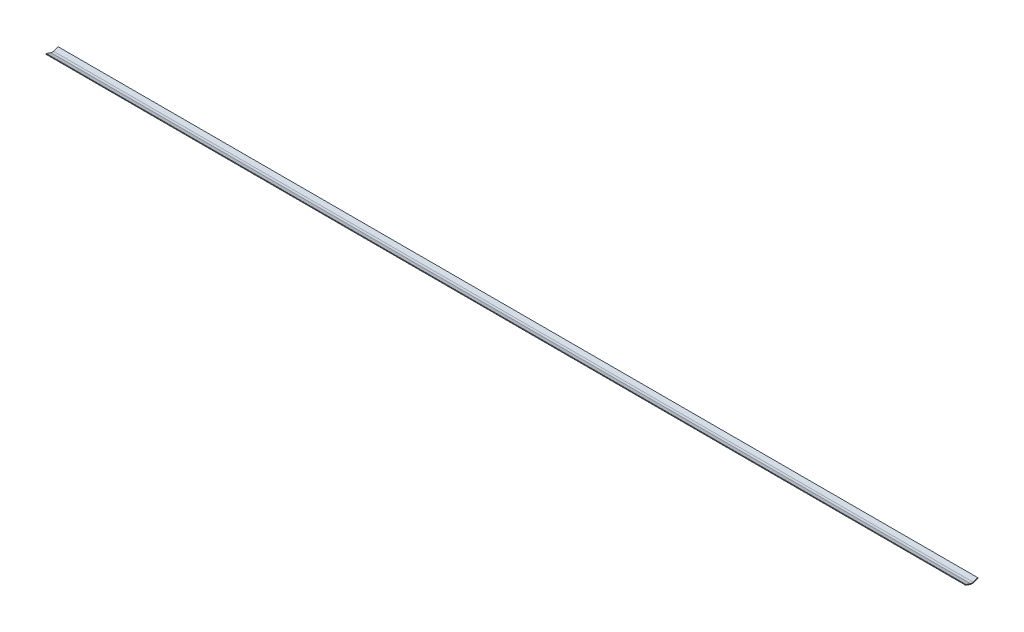
ISO-10303-21;
HEADER;
FILE_DESCRIPTION(('STEP AP214'),'2;1');
FILE_NAME('part.step','',(''),(''),'','','');
FILE_SCHEMA(('AUTOMOTIVE_DESIGN { 1 0 10303 214 1 1 1 1 }'));
ENDSEC;
DATA;
#1=APPLICATION_CONTEXT('core data for automotive mechanical design processes');
#2=APPLICATION_PROTOCOL_DEFINITION('international standard','automotive_design',2000,#1);
#3=PRODUCT_CONTEXT('',#1,'mechanical');
#4=PRODUCT('Part','Part','',(#3));
#5=PRODUCT_RELATED_PRODUCT_CATEGORY('part','',(#4));
#6=PRODUCT_DEFINITION_FORMATION('','',#4);
#7=PRODUCT_DEFINITION_CONTEXT('part definition',#1,'design');
#8=PRODUCT_DEFINITION('design','',#6,#7);
#9=PRODUCT_DEFINITION_SHAPE('','',#8);
#10=(LENGTH_UNIT() NAMED_UNIT(*) SI_UNIT(.MILLI.,.METRE.));
#11=(NAMED_UNIT(*) PLANE_ANGLE_UNIT() SI_UNIT($,.RADIAN.));
#12=(NAMED_UNIT(*) SI_UNIT($,.STERADIAN.) SOLID_ANGLE_UNIT());
#13=UNCERTAINTY_MEASURE_WITH_UNIT(LENGTH_MEASURE(1.E-05),#10,'distance_accuracy_value','');
#14=(GEOMETRIC_REPRESENTATION_CONTEXT(3) GLOBAL_UNCERTAINTY_ASSIGNED_CONTEXT((#13)) GLOBAL_UNIT_ASSIGNED_CONTEXT((#10,
#11,#12)) REPRESENTATION_CONTEXT('',''));
#15=CARTESIAN_POINT('',(0.,0.,0.));
#16=DIRECTION('',(0.,0.,1.));
#17=DIRECTION('',(1.,0.,0.));
#18=AXIS2_PLACEMENT_3D('',#15,#16,#17);
#19=CARTESIAN_POINT('',(1499.,1.65334887105103,4.84469669191699));
#20=DIRECTION('',(1.,0.,0.));
#21=DIRECTION('',(0.,0.,-1.));
#22=AXIS2_PLACEMENT_3D('',#19,#20,#21);
#23=PLANE('',#22);
#24=DIRECTION('',(0.,0.946405865397737,-0.322979779461132));
#25=VECTOR('',#24,1.);
#26=CARTESIAN_POINT('',(1499.,1.65334887105103,4.84469669191699));
#27=LINE('',#26,#25);
#28=CARTESIAN_POINT('',(1499.,1.65334887105103,4.84469669191699));
#29=VERTEX_POINT('',#28);
#30=CARTESIAN_POINT('',(1499.,3.54616060184651,4.19873713299472));
#31=VERTEX_POINT('',#30);
#32=EDGE_CURVE('E11',#29,#31,#27,.T.);
#33=ORIENTED_EDGE('',*,*,#32,.F.);
#34=CARTESIAN_POINT('',(1499.,15.8494368520171,0.));
#35=DIRECTION('',(1.,0.,0.));
#36=DIRECTION('',(0.,0.,-1.));
#37=AXIS2_PLACEMENT_3D('',#34,#35,#36);
#38=CIRCLE('',#37,15.);
#39=CARTESIAN_POINT('',(1499.,1.65334887105103,-4.84469669191697));
#40=VERTEX_POINT('',#39);
#41=EDGE_CURVE('E135',#40,#29,#38,.F.);
#42=ORIENTED_EDGE('',*,*,#41,.F.);
#43=DIRECTION('',(0.,-0.946405865397735,-0.322979779461137));
#44=VECTOR('',#43,1.);
#45=CARTESIAN_POINT('',(1499.,3.5461606018465,-4.1987371329947));
#46=LINE('',#45,#44);
#47=CARTESIAN_POINT('',(1499.,3.5461606018465,-4.1987371329947));
#48=VERTEX_POINT('',#47);
#49=EDGE_CURVE('E46',#48,#40,#46,.T.);
#50=ORIENTED_EDGE('',*,*,#49,.F.);
#51=CARTESIAN_POINT('',(1499.,15.8494368520171,0.));
#52=DIRECTION('',(1.,0.,0.));
#53=DIRECTION('',(0.,0.,-1.));
#54=AXIS2_PLACEMENT_3D('',#51,#52,#53);
#55=CIRCLE('',#54,13.);
#56=EDGE_CURVE('E128',#48,#31,#55,.F.);
#57=ORIENTED_EDGE('',*,*,#56,.T.);
#58=EDGE_LOOP('',(#33,#42,#50,#57));
#59=FACE_BOUND('',#58,.T.);
#60=ADVANCED_FACE('F38',(#59),#23,.T.);
#61=CARTESIAN_POINT('',(1499.,3.5461606018465,-4.1987371329947));
#62=DIRECTION('',(1.,0.,0.));
#63=DIRECTION('',(0.,0.,-1.));
#64=AXIS2_PLACEMENT_3D('',#61,#62,#63);
#65=PLANE('',#64);
#66=DIRECTION('',(0.,0.322979779461132,0.946405865397736));
#67=VECTOR('',#66,1.);
#68=CARTESIAN_POINT('',(1499.,0.,0.));
#69=LINE('',#68,#67);
#70=CARTESIAN_POINT('',(1499.,6.82539682539682,20.));
#71=VERTEX_POINT('',#70);
#72=EDGE_CURVE('E184',#29,#71,#69,.T.);
#73=ORIENTED_EDGE('',*,*,#72,.F.);
#74=ORIENTED_EDGE('',*,*,#32,.T.);
#75=DIRECTION('',(0.,0.322979779461132,0.946405865397737));
#76=VECTOR('',#75,1.);
#77=CARTESIAN_POINT('',(1499.,1.89281173079547,-0.645959558922264));
#78=LINE('',#77,#76);
#79=CARTESIAN_POINT('',(1499.,8.71820855619229,19.3540404410777));
#80=VERTEX_POINT('',#79);
#81=EDGE_CURVE('E94',#31,#80,#78,.T.);
#82=ORIENTED_EDGE('',*,*,#81,.T.);
#83=DIRECTION('',(0.,0.946405865397737,-0.32297977946113));
#84=VECTOR('',#83,1.);
#85=CARTESIAN_POINT('',(1499.,6.82539682539682,20.));
#86=LINE('',#85,#84);
#87=EDGE_CURVE('E341',#71,#80,#86,.T.);
#88=ORIENTED_EDGE('',*,*,#87,.F.);
#89=EDGE_LOOP('',(#73,#74,#82,#88));
#90=FACE_BOUND('',#89,.T.);
#91=ADVANCED_FACE('F192',(#90),#65,.T.);
#92=CARTESIAN_POINT('',(-1499.,1.65334887105103,-4.84469669191697));
#93=DIRECTION('',(-1.,0.,0.));
#94=DIRECTION('',(0.,0.,1.));
#95=AXIS2_PLACEMENT_3D('',#92,#93,#94);
#96=PLANE('',#95);
#97=DIRECTION('',(0.,0.946405865397735,0.322979779461137));
#98=VECTOR('',#97,1.);
#99=CARTESIAN_POINT('',(-1499.,1.65334887105103,-4.84469669191697));
#100=LINE('',#99,#98);
#101=CARTESIAN_POINT('',(-1499.,1.65334887105103,-4.84469669191697));
#102=VERTEX_POINT('',#101);
#103=CARTESIAN_POINT('',(-1499.,3.5461606018465,-4.1987371329947));
#104=VERTEX_POINT('',#103);
#105=EDGE_CURVE('E81',#102,#104,#100,.T.);
#106=ORIENTED_EDGE('',*,*,#105,.F.);
#107=CARTESIAN_POINT('',(-1499.,15.8494368520171,0.));
#108=DIRECTION('',(1.,0.,0.));
#109=DIRECTION('',(0.,0.,-1.));
#110=AXIS2_PLACEMENT_3D('',#107,#108,#109);
#111=CIRCLE('',#110,15.);
#112=CARTESIAN_POINT('',(-1499.,1.65334887105103,4.84469669191699));
#113=VERTEX_POINT('',#112);
#114=EDGE_CURVE('E150',#102,#113,#111,.F.);
#115=ORIENTED_EDGE('',*,*,#114,.T.);
#116=DIRECTION('',(0.,-0.946405865397737,0.322979779461132));
#117=VECTOR('',#116,1.);
#118=CARTESIAN_POINT('',(-1499.,3.54616060184651,4.19873713299472));
#119=LINE('',#118,#117);
#120=CARTESIAN_POINT('',(-1499.,3.54616060184651,4.19873713299472));
#121=VERTEX_POINT('',#120);
#122=EDGE_CURVE('E88',#121,#113,#119,.T.);
#123=ORIENTED_EDGE('',*,*,#122,.F.);
#124=CARTESIAN_POINT('',(-1499.,15.8494368520171,0.));
#125=DIRECTION('',(1.,0.,0.));
#126=DIRECTION('',(0.,0.,-1.));
#127=AXIS2_PLACEMENT_3D('',#124,#125,#126);
#128=CIRCLE('',#127,13.);
#129=EDGE_CURVE('E157',#104,#121,#128,.F.);
#130=ORIENTED_EDGE('',*,*,#129,.F.);
#131=EDGE_LOOP('',(#106,#115,#123,#130));
#132=FACE_BOUND('',#131,.T.);
#133=ADVANCED_FACE('F190',(#132),#96,.T.);
#134=CARTESIAN_POINT('',(-1499.,3.54616060184651,4.19873713299472));
#135=DIRECTION('',(-1.,0.,0.));
#136=DIRECTION('',(0.,0.,1.));
#137=AXIS2_PLACEMENT_3D('',#134,#135,#136);
#138=PLANE('',#137);
#139=DIRECTION('',(0.,-0.322979779461132,0.946405865397736));
#140=VECTOR('',#139,1.);
#141=CARTESIAN_POINT('',(-1499.,0.,0.));
#142=LINE('',#141,#140);
#143=CARTESIAN_POINT('',(-1499.,6.82539682539683,-20.));
#144=VERTEX_POINT('',#143);
#145=EDGE_CURVE('E152',#144,#102,#142,.T.);
#146=ORIENTED_EDGE('',*,*,#145,.T.);
#147=ORIENTED_EDGE('',*,*,#105,.T.);
#148=DIRECTION('',(0.,-0.322979779461132,0.946405865397736));
#149=VECTOR('',#148,1.);
#150=CARTESIAN_POINT('',(-1499.,1.89281173079547,0.645959558922265));
#151=LINE('',#150,#149);
#152=CARTESIAN_POINT('',(-1499.,8.7182085561923,-19.3540404410777));
#153=VERTEX_POINT('',#152);
#154=EDGE_CURVE('E155',#153,#104,#151,.T.);
#155=ORIENTED_EDGE('',*,*,#154,.F.);
#156=DIRECTION('',(0.,-0.946405865397737,-0.32297977946113));
#157=VECTOR('',#156,1.);
#158=CARTESIAN_POINT('',(-1499.,8.7182085561923,-19.3540404410777));
#159=LINE('',#158,#157);
#160=EDGE_CURVE('E116',#153,#144,#159,.T.);
#161=ORIENTED_EDGE('',*,*,#160,.T.);
#162=EDGE_LOOP('',(#146,#147,#155,#161));
#163=FACE_BOUND('',#162,.T.);
#164=ADVANCED_FACE('F186',(#163),#138,.T.);
#165=CARTESIAN_POINT('',(1499.,1.89281173079547,-0.645959558922264));
#166=DIRECTION('',(0.,-0.946405865397736,0.322979779461132));
#167=DIRECTION('',(0.,-0.322979779461132,-0.946405865397737));
#168=AXIS2_PLACEMENT_3D('',#165,#166,#167);
#169=PLANE('',#168);
#170=DIRECTION('',(0.,0.322979779461132,0.946405865397737));
#171=VECTOR('',#170,1.);
#172=CARTESIAN_POINT('',(-1499.,1.89281173079547,-0.645959558922264));
#173=LINE('',#172,#171);
#174=CARTESIAN_POINT('',(-1499.,8.71820855619229,19.3540404410777));
#175=VERTEX_POINT('',#174);
#176=EDGE_CURVE('E141',#121,#175,#173,.T.);
#177=ORIENTED_EDGE('',*,*,#176,.T.);
#178=DIRECTION('',(-1.,0.,0.));
#179=VECTOR('',#178,1.);
#180=CARTESIAN_POINT('',(1499.,8.71820855619229,19.3540404410777));
#181=LINE('',#180,#179);
#182=EDGE_CURVE('E171',#80,#175,#181,.T.);
#183=ORIENTED_EDGE('',*,*,#182,.F.);
#184=ORIENTED_EDGE('',*,*,#81,.F.);
#185=DIRECTION('',(-1.,0.,0.));
#186=VECTOR('',#185,1.);
#187=CARTESIAN_POINT('',(1499.,3.54616060184651,4.19873713299472));
#188=LINE('',#187,#186);
#189=EDGE_CURVE('E140',#31,#121,#188,.T.);
#190=ORIENTED_EDGE('',*,*,#189,.T.);
#191=EDGE_LOOP('',(#177,#183,#184,#190));
#192=FACE_BOUND('',#191,.T.);
#193=ADVANCED_FACE('F198',(#192),#169,.F.);
#194=CARTESIAN_POINT('',(1499.,6.82539682539682,20.));
#195=DIRECTION('',(0.,0.32297977946113,0.946405865397737));
#196=DIRECTION('',(0.,-0.946405865397737,0.32297977946113));
#197=AXIS2_PLACEMENT_3D('',#194,#195,#196);
#198=PLANE('',#197);
#199=DIRECTION('',(0.,0.946405865397737,-0.32297977946113));
#200=VECTOR('',#199,1.);
#201=CARTESIAN_POINT('',(-1499.,6.82539682539682,20.));
#202=LINE('',#201,#200);
#203=CARTESIAN_POINT('',(-1499.,6.82539682539682,20.));
#204=VERTEX_POINT('',#203);
#205=EDGE_CURVE('E144',#204,#175,#202,.T.);
#206=ORIENTED_EDGE('',*,*,#205,.F.);
#207=DIRECTION('',(-1.,0.,0.));
#208=VECTOR('',#207,1.);
#209=CARTESIAN_POINT('',(1499.,6.82539682539682,20.));
#210=LINE('',#209,#208);
#211=EDGE_CURVE('E169',#71,#204,#210,.T.);
#212=ORIENTED_EDGE('',*,*,#211,.F.);
#213=ORIENTED_EDGE('',*,*,#87,.T.);
#214=ORIENTED_EDGE('',*,*,#182,.T.);
#215=EDGE_LOOP('',(#206,#212,#213,#214));
#216=FACE_BOUND('',#215,.T.);
#217=ADVANCED_FACE('F229',(#216),#198,.T.);
#218=CARTESIAN_POINT('',(1499.,0.,0.));
#219=DIRECTION('',(0.,-0.946405865397737,0.322979779461132));
#220=DIRECTION('',(0.,-0.322979779461132,-0.946405865397737));
#221=AXIS2_PLACEMENT_3D('',#218,#219,#220);
#222=PLANE('',#221);
#223=DIRECTION('',(0.,0.322979779461132,0.946405865397736));
#224=VECTOR('',#223,1.);
#225=CARTESIAN_POINT('',(-1499.,0.,0.));
#226=LINE('',#225,#224);
#227=EDGE_CURVE('E147',#113,#204,#226,.T.);
#228=ORIENTED_EDGE('',*,*,#227,.F.);
#229=DIRECTION('',(-1.,0.,0.));
#230=VECTOR('',#229,1.);
#231=CARTESIAN_POINT('',(1499.,1.65334887105103,4.84469669191699));
#232=LINE('',#231,#230);
#233=EDGE_CURVE('E166',#29,#113,#232,.T.);
#234=ORIENTED_EDGE('',*,*,#233,.F.);
#235=ORIENTED_EDGE('',*,*,#72,.T.);
#236=ORIENTED_EDGE('',*,*,#211,.T.);
#237=EDGE_LOOP('',(#228,#234,#235,#236));
#238=FACE_BOUND('',#237,.T.);
#239=ADVANCED_FACE('F240',(#238),#222,.T.);
#240=CARTESIAN_POINT('',(1499.,15.8494368520171,0.));
#241=DIRECTION('',(-1.,0.,0.));
#242=DIRECTION('',(0.,0.,1.));
#243=AXIS2_PLACEMENT_3D('',#240,#241,#242);
#244=CYLINDRICAL_SURFACE('',#243,15.);
#245=ORIENTED_EDGE('',*,*,#114,.F.);
#246=DIRECTION('',(-1.,0.,0.));
#247=VECTOR('',#246,1.);
#248=CARTESIAN_POINT('',(1499.,1.65334887105103,-4.84469669191697));
#249=LINE('',#248,#247);
#250=EDGE_CURVE('E163',#40,#102,#249,.T.);
#251=ORIENTED_EDGE('',*,*,#250,.F.);
#252=ORIENTED_EDGE('',*,*,#41,.T.);
#253=ORIENTED_EDGE('',*,*,#233,.T.);
#254=EDGE_LOOP('',(#245,#251,#252,#253));
#255=FACE_BOUND('',#254,.T.);
#256=ADVANCED_FACE('F180',(#255),#244,.T.);
#257=CARTESIAN_POINT('',(1499.,0.,0.));
#258=DIRECTION('',(0.,-0.946405865397736,-0.322979779461132));
#259=DIRECTION('',(0.,0.322979779461132,-0.946405865397736));
#260=AXIS2_PLACEMENT_3D('',#257,#258,#259);
#261=PLANE('',#260);
#262=ORIENTED_EDGE('',*,*,#145,.F.);
#263=DIRECTION('',(-1.,0.,0.));
#264=VECTOR('',#263,1.);
#265=CARTESIAN_POINT('',(1499.,6.82539682539683,-20.));
#266=LINE('',#265,#264);
#267=CARTESIAN_POINT('',(1499.,6.82539682539683,-20.));
#268=VERTEX_POINT('',#267);
#269=EDGE_CURVE('E118',#268,#144,#266,.T.);
#270=ORIENTED_EDGE('',*,*,#269,.F.);
#271=DIRECTION('',(0.,-0.322979779461132,0.946405865397736));
#272=VECTOR('',#271,1.);
#273=CARTESIAN_POINT('',(1499.,0.,0.));
#274=LINE('',#273,#272);
#275=EDGE_CURVE('E133',#268,#40,#274,.T.);
#276=ORIENTED_EDGE('',*,*,#275,.T.);
#277=ORIENTED_EDGE('',*,*,#250,.T.);
#278=EDGE_LOOP('',(#262,#270,#276,#277));
#279=FACE_BOUND('',#278,.T.);
#280=ADVANCED_FACE('F185',(#279),#261,.T.);
#281=CARTESIAN_POINT('',(1499.,8.7182085561923,-19.3540404410777));
#282=DIRECTION('',(0.,0.32297977946113,-0.946405865397737));
#283=DIRECTION('',(0.,0.946405865397737,0.32297977946113));
#284=AXIS2_PLACEMENT_3D('',#281,#282,#283);
#285=PLANE('',#284);
#286=ORIENTED_EDGE('',*,*,#160,.F.);
#287=DIRECTION('',(-1.,0.,0.));
#288=VECTOR('',#287,1.);
#289=CARTESIAN_POINT('',(1499.,8.7182085561923,-19.3540404410777));
#290=LINE('',#289,#288);
#291=CARTESIAN_POINT('',(1499.,8.7182085561923,-19.3540404410777));
#292=VERTEX_POINT('',#291);
#293=EDGE_CURVE('E110',#292,#153,#290,.T.);
#294=ORIENTED_EDGE('',*,*,#293,.F.);
#295=DIRECTION('',(0.,-0.946405865397737,-0.32297977946113));
#296=VECTOR('',#295,1.);
#297=CARTESIAN_POINT('',(1499.,8.7182085561923,-19.3540404410777));
#298=LINE('',#297,#296);
#299=EDGE_CURVE('E114',#292,#268,#298,.T.);
#300=ORIENTED_EDGE('',*,*,#299,.T.);
#301=ORIENTED_EDGE('',*,*,#269,.T.);
#302=EDGE_LOOP('',(#286,#294,#300,#301));
#303=FACE_BOUND('',#302,.T.);
#304=ADVANCED_FACE('F112',(#303),#285,.T.);
#305=CARTESIAN_POINT('',(1499.,1.89281173079547,0.645959558922265));
#306=DIRECTION('',(0.,-0.946405865397736,-0.322979779461133));
#307=DIRECTION('',(0.,0.322979779461133,-0.946405865397736));
#308=AXIS2_PLACEMENT_3D('',#305,#306,#307);
#309=PLANE('',#308);
#310=ORIENTED_EDGE('',*,*,#154,.T.);
#311=DIRECTION('',(-1.,0.,0.));
#312=VECTOR('',#311,1.);
#313=CARTESIAN_POINT('',(1499.,3.5461606018465,-4.1987371329947));
#314=LINE('',#313,#312);
#315=EDGE_CURVE('E119',#48,#104,#314,.T.);
#316=ORIENTED_EDGE('',*,*,#315,.F.);
#317=DIRECTION('',(0.,-0.322979779461132,0.946405865397736));
#318=VECTOR('',#317,1.);
#319=CARTESIAN_POINT('',(1499.,1.89281173079547,0.645959558922265));
#320=LINE('',#319,#318);
#321=EDGE_CURVE('E123',#292,#48,#320,.T.);
#322=ORIENTED_EDGE('',*,*,#321,.F.);
#323=ORIENTED_EDGE('',*,*,#293,.T.);
#324=EDGE_LOOP('',(#310,#316,#322,#323));
#325=FACE_BOUND('',#324,.T.);
#326=ADVANCED_FACE('F124',(#325),#309,.F.);
#327=CARTESIAN_POINT('',(1499.,15.8494368520171,0.));
#328=DIRECTION('',(-1.,0.,0.));
#329=DIRECTION('',(0.,0.,1.));
#330=AXIS2_PLACEMENT_3D('',#327,#328,#329);
#331=CYLINDRICAL_SURFACE('',#330,13.);
#332=ORIENTED_EDGE('',*,*,#129,.T.);
#333=ORIENTED_EDGE('',*,*,#189,.F.);
#334=ORIENTED_EDGE('',*,*,#56,.F.);
#335=ORIENTED_EDGE('',*,*,#315,.T.);
#336=EDGE_LOOP('',(#332,#333,#334,#335));
#337=FACE_BOUND('',#336,.T.);
#338=ADVANCED_FACE('F188',(#337),#331,.F.);
#339=CARTESIAN_POINT('',(1499.,15.8494368520171,0.));
#340=DIRECTION('',(1.,0.,0.));
#341=DIRECTION('',(0.,0.,-1.));
#342=AXIS2_PLACEMENT_3D('',#339,#340,#341);
#343=PLANE('',#342);
#344=ORIENTED_EDGE('',*,*,#321,.T.);
#345=ORIENTED_EDGE('',*,*,#49,.T.);
#346=ORIENTED_EDGE('',*,*,#275,.F.);
#347=ORIENTED_EDGE('',*,*,#299,.F.);
#348=EDGE_LOOP('',(#344,#345,#346,#347));
#349=FACE_BOUND('',#348,.T.);
#350=ADVANCED_FACE('F131',(#349),#343,.T.);
#351=CARTESIAN_POINT('',(-1499.,15.8494368520171,0.));
#352=DIRECTION('',(1.,0.,0.));
#353=DIRECTION('',(0.,0.,-1.));
#354=AXIS2_PLACEMENT_3D('',#351,#352,#353);
#355=PLANE('',#354);
#356=ORIENTED_EDGE('',*,*,#176,.F.);
#357=ORIENTED_EDGE('',*,*,#122,.T.);
#358=ORIENTED_EDGE('',*,*,#227,.T.);
#359=ORIENTED_EDGE('',*,*,#205,.T.);
#360=EDGE_LOOP('',(#356,#357,#358,#359));
#361=FACE_BOUND('',#360,.T.);
#362=ADVANCED_FACE('F306',(#361),#355,.F.);
#363=CLOSED_SHELL('',(#60,#91,#133,#164,#193,#217,#239,#256,#280,#304,#326,#338,#350,#362));
#364=MANIFOLD_SOLID_BREP('B2',#363);
#365=ADVANCED_BREP_SHAPE_REPRESENTATION('',(#18,#364),#14);
#366=SHAPE_DEFINITION_REPRESENTATION(#9,#365);
ENDSEC;
END-ISO-10303-21;
